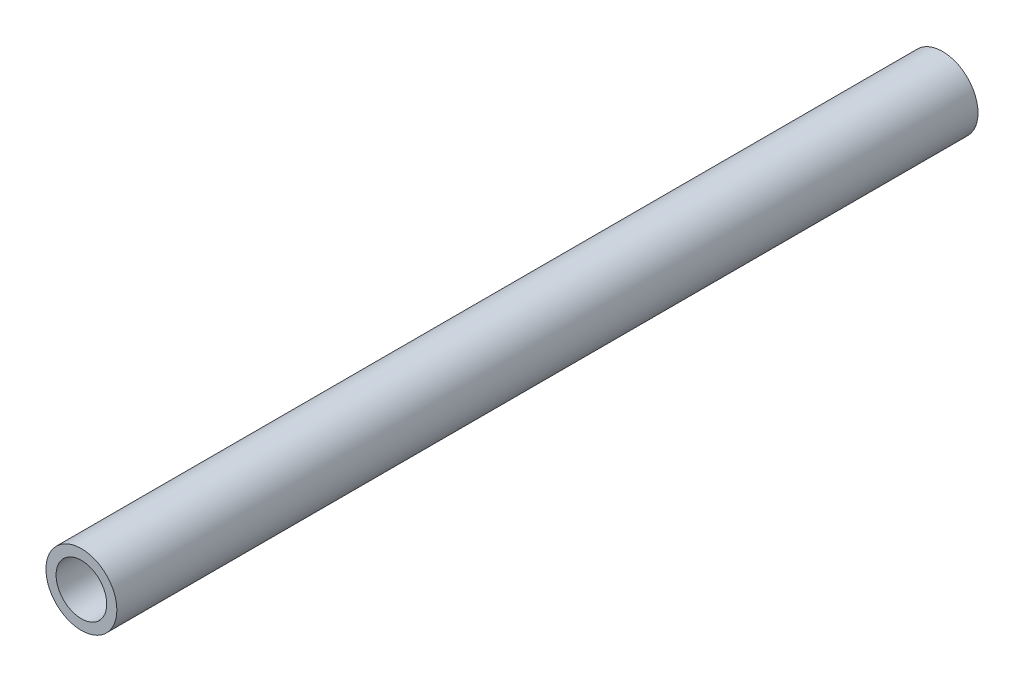
ISO-10303-21;
HEADER;
FILE_DESCRIPTION(('STEP AP214'),'2;1');
FILE_NAME('part.step','',(''),(''),'','','');
FILE_SCHEMA(('AUTOMOTIVE_DESIGN { 1 0 10303 214 1 1 1 1 }'));
ENDSEC;
DATA;
#1=APPLICATION_CONTEXT('core data for automotive mechanical design processes');
#2=APPLICATION_PROTOCOL_DEFINITION('international standard','automotive_design',2000,#1);
#3=PRODUCT_CONTEXT('',#1,'mechanical');
#4=PRODUCT('Part','Part','',(#3));
#5=PRODUCT_RELATED_PRODUCT_CATEGORY('part','',(#4));
#6=PRODUCT_DEFINITION_FORMATION('','',#4);
#7=PRODUCT_DEFINITION_CONTEXT('part definition',#1,'design');
#8=PRODUCT_DEFINITION('design','',#6,#7);
#9=PRODUCT_DEFINITION_SHAPE('','',#8);
#10=(LENGTH_UNIT() NAMED_UNIT(*) SI_UNIT(.MILLI.,.METRE.));
#11=(NAMED_UNIT(*) PLANE_ANGLE_UNIT() SI_UNIT($,.RADIAN.));
#12=(NAMED_UNIT(*) SI_UNIT($,.STERADIAN.) SOLID_ANGLE_UNIT());
#13=UNCERTAINTY_MEASURE_WITH_UNIT(LENGTH_MEASURE(1.E-05),#10,'distance_accuracy_value','');
#14=(GEOMETRIC_REPRESENTATION_CONTEXT(3) GLOBAL_UNCERTAINTY_ASSIGNED_CONTEXT((#13)) GLOBAL_UNIT_ASSIGNED_CONTEXT((#10,
#11,#12)) REPRESENTATION_CONTEXT('',''));
#15=CARTESIAN_POINT('',(0.,0.,0.));
#16=DIRECTION('',(0.,0.,1.));
#17=DIRECTION('',(1.,0.,0.));
#18=AXIS2_PLACEMENT_3D('',#15,#16,#17);
#19=CARTESIAN_POINT('',(0.,0.,850.));
#20=DIRECTION('',(0.,0.,1.));
#21=DIRECTION('',(1.,0.,0.));
#22=AXIS2_PLACEMENT_3D('',#19,#20,#21);
#23=PLANE('',#22);
#24=CARTESIAN_POINT('',(0.,0.,850.));
#25=DIRECTION('',(0.,0.,1.));
#26=DIRECTION('',(1.,0.,0.));
#27=AXIS2_PLACEMENT_3D('',#24,#25,#26);
#28=CIRCLE('',#27,70.);
#29=CARTESIAN_POINT('',(70.,0.,850.));
#30=VERTEX_POINT('',#29);
#31=EDGE_CURVE('E10',#30,#30,#28,.T.);
#32=ORIENTED_EDGE('',*,*,#31,.T.);
#33=EDGE_LOOP('',(#32));
#34=FACE_BOUND('',#33,.T.);
#35=CARTESIAN_POINT('',(0.,0.,850.));
#36=DIRECTION('',(0.,0.,1.));
#37=DIRECTION('',(1.,0.,0.));
#38=AXIS2_PLACEMENT_3D('',#35,#36,#37);
#39=CIRCLE('',#38,50.);
#40=CARTESIAN_POINT('',(50.,0.,850.));
#41=VERTEX_POINT('',#40);
#42=EDGE_CURVE('E54',#41,#41,#39,.T.);
#43=ORIENTED_EDGE('',*,*,#42,.F.);
#44=EDGE_LOOP('',(#43));
#45=FACE_BOUND('',#44,.T.);
#46=ADVANCED_FACE('F40',(#34,#45),#23,.T.);
#47=CARTESIAN_POINT('',(0.,0.,-850.));
#48=DIRECTION('',(0.,0.,1.));
#49=DIRECTION('',(1.,0.,0.));
#50=AXIS2_PLACEMENT_3D('',#47,#48,#49);
#51=PLANE('',#50);
#52=CARTESIAN_POINT('',(0.,0.,-850.));
#53=DIRECTION('',(0.,0.,1.));
#54=DIRECTION('',(1.,0.,0.));
#55=AXIS2_PLACEMENT_3D('',#52,#53,#54);
#56=CIRCLE('',#55,70.);
#57=CARTESIAN_POINT('',(70.,0.,-850.));
#58=VERTEX_POINT('',#57);
#59=EDGE_CURVE('E44',#58,#58,#56,.T.);
#60=ORIENTED_EDGE('',*,*,#59,.F.);
#61=EDGE_LOOP('',(#60));
#62=FACE_BOUND('',#61,.T.);
#63=CARTESIAN_POINT('',(0.,0.,-850.));
#64=DIRECTION('',(0.,0.,1.));
#65=DIRECTION('',(1.,0.,0.));
#66=AXIS2_PLACEMENT_3D('',#63,#64,#65);
#67=CIRCLE('',#66,50.);
#68=CARTESIAN_POINT('',(50.,0.,-850.));
#69=VERTEX_POINT('',#68);
#70=EDGE_CURVE('E56',#69,#69,#67,.T.);
#71=ORIENTED_EDGE('',*,*,#70,.T.);
#72=EDGE_LOOP('',(#71));
#73=FACE_BOUND('',#72,.T.);
#74=ADVANCED_FACE('F67',(#62,#73),#51,.F.);
#75=CARTESIAN_POINT('',(0.,0.,850.));
#76=DIRECTION('',(0.,0.,-1.));
#77=DIRECTION('',(-1.,0.,0.));
#78=AXIS2_PLACEMENT_3D('',#75,#76,#77);
#79=CYLINDRICAL_SURFACE('',#78,70.);
#80=ORIENTED_EDGE('',*,*,#31,.F.);
#81=EDGE_LOOP('',(#80));
#82=FACE_BOUND('',#81,.T.);
#83=ORIENTED_EDGE('',*,*,#59,.T.);
#84=EDGE_LOOP('',(#83));
#85=FACE_BOUND('',#84,.T.);
#86=ADVANCED_FACE('F42',(#82,#85),#79,.T.);
#87=CARTESIAN_POINT('',(0.,0.,850.));
#88=DIRECTION('',(0.,0.,-1.));
#89=DIRECTION('',(-1.,0.,0.));
#90=AXIS2_PLACEMENT_3D('',#87,#88,#89);
#91=CYLINDRICAL_SURFACE('',#90,50.);
#92=ORIENTED_EDGE('',*,*,#42,.T.);
#93=EDGE_LOOP('',(#92));
#94=FACE_BOUND('',#93,.T.);
#95=ORIENTED_EDGE('',*,*,#70,.F.);
#96=EDGE_LOOP('',(#95));
#97=FACE_BOUND('',#96,.T.);
#98=ADVANCED_FACE('F63',(#94,#97),#91,.F.);
#99=CLOSED_SHELL('',(#46,#74,#86,#98));
#100=MANIFOLD_SOLID_BREP('B2',#99);
#101=ADVANCED_BREP_SHAPE_REPRESENTATION('',(#18,#100),#14);
#102=SHAPE_DEFINITION_REPRESENTATION(#9,#101);
ENDSEC;
END-ISO-10303-21;
